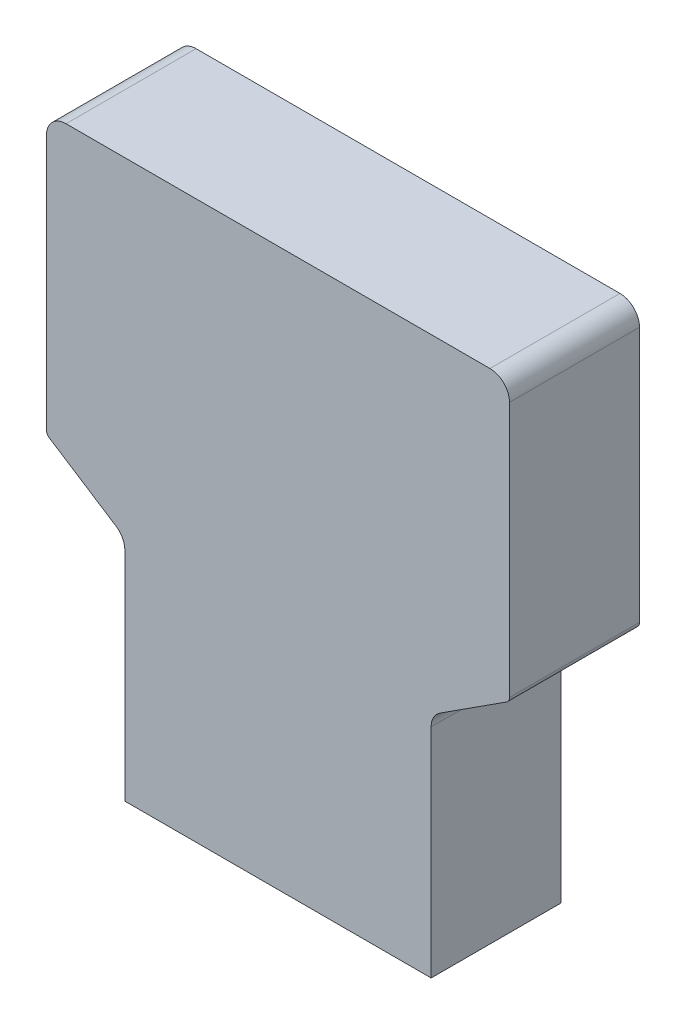
ISO-10303-21;
HEADER;
FILE_DESCRIPTION(('STEP AP214'),'2;1');
FILE_NAME('part.step','',(''),(''),'','','');
FILE_SCHEMA(('AUTOMOTIVE_DESIGN { 1 0 10303 214 1 1 1 1 }'));
ENDSEC;
DATA;
#1=APPLICATION_CONTEXT('core data for automotive mechanical design processes');
#2=APPLICATION_PROTOCOL_DEFINITION('international standard','automotive_design',2000,#1);
#3=PRODUCT_CONTEXT('',#1,'mechanical');
#4=PRODUCT('Part','Part','',(#3));
#5=PRODUCT_RELATED_PRODUCT_CATEGORY('part','',(#4));
#6=PRODUCT_DEFINITION_FORMATION('','',#4);
#7=PRODUCT_DEFINITION_CONTEXT('part definition',#1,'design');
#8=PRODUCT_DEFINITION('design','',#6,#7);
#9=PRODUCT_DEFINITION_SHAPE('','',#8);
#10=(LENGTH_UNIT() NAMED_UNIT(*) SI_UNIT(.MILLI.,.METRE.));
#11=(NAMED_UNIT(*) PLANE_ANGLE_UNIT() SI_UNIT($,.RADIAN.));
#12=(NAMED_UNIT(*) SI_UNIT($,.STERADIAN.) SOLID_ANGLE_UNIT());
#13=UNCERTAINTY_MEASURE_WITH_UNIT(LENGTH_MEASURE(1.E-05),#10,'distance_accuracy_value','');
#14=(GEOMETRIC_REPRESENTATION_CONTEXT(3) GLOBAL_UNCERTAINTY_ASSIGNED_CONTEXT((#13)) GLOBAL_UNIT_ASSIGNED_CONTEXT((#10,
#11,#12)) REPRESENTATION_CONTEXT('',''));
#15=CARTESIAN_POINT('',(0.,0.,0.));
#16=DIRECTION('',(0.,0.,1.));
#17=DIRECTION('',(1.,0.,0.));
#18=AXIS2_PLACEMENT_3D('',#15,#16,#17);
#19=CARTESIAN_POINT('',(20.2172812548055,0.,9.975));
#20=DIRECTION('',(-1.,0.,0.));
#21=DIRECTION('',(0.,-1.,0.));
#22=AXIS2_PLACEMENT_3D('',#19,#20,#21);
#23=PLANE('',#22);
#24=DIRECTION('',(0.,1.,0.));
#25=VECTOR('',#24,1.);
#26=CARTESIAN_POINT('',(20.2172812548055,0.,-9.975));
#27=LINE('',#26,#25);
#28=CARTESIAN_POINT('',(20.2172812548055,-38.7990927264339,-9.975));
#29=VERTEX_POINT('',#28);
#30=CARTESIAN_POINT('',(20.2172812548055,-5.43432971414005,-9.975));
#31=VERTEX_POINT('',#30);
#32=EDGE_CURVE('E166',#29,#31,#27,.T.);
#33=ORIENTED_EDGE('',*,*,#32,.T.);
#34=DIRECTION('',(0.,0.,-1.));
#35=VECTOR('',#34,1.);
#36=CARTESIAN_POINT('',(20.2172812548055,-5.43432971414005,9.975));
#37=LINE('',#36,#35);
#38=CARTESIAN_POINT('',(20.2172812548055,-5.43432971414005,9.975));
#39=VERTEX_POINT('',#38);
#40=EDGE_CURVE('E11',#39,#31,#37,.T.);
#41=ORIENTED_EDGE('',*,*,#40,.F.);
#42=DIRECTION('',(0.,1.,0.));
#43=VECTOR('',#42,1.);
#44=CARTESIAN_POINT('',(20.2172812548055,0.,9.975));
#45=LINE('',#44,#43);
#46=CARTESIAN_POINT('',(20.2172812548055,-38.7990927264339,9.975));
#47=VERTEX_POINT('',#46);
#48=EDGE_CURVE('E200',#47,#39,#45,.T.);
#49=ORIENTED_EDGE('',*,*,#48,.F.);
#50=DIRECTION('',(0.,0.,-1.));
#51=VECTOR('',#50,1.);
#52=CARTESIAN_POINT('',(20.2172812548055,-38.7990927264339,9.975));
#53=LINE('',#52,#51);
#54=EDGE_CURVE('E162',#47,#29,#53,.T.);
#55=ORIENTED_EDGE('',*,*,#54,.T.);
#56=EDGE_LOOP('',(#33,#41,#49,#55));
#57=FACE_BOUND('',#56,.T.);
#58=ADVANCED_FACE('F35',(#57),#23,.F.);
#59=CARTESIAN_POINT('',(23.2172812548055,-5.43432971414005,9.975));
#60=DIRECTION('',(0.,0.,-1.));
#61=DIRECTION('',(-1.,0.,0.));
#62=AXIS2_PLACEMENT_3D('',#59,#60,#61);
#63=CYLINDRICAL_SURFACE('',#62,3.);
#64=CARTESIAN_POINT('',(23.2172812548055,-5.43432971414005,-9.975));
#65=DIRECTION('',(0.,0.,1.));
#66=DIRECTION('',(1.,0.,0.));
#67=AXIS2_PLACEMENT_3D('',#64,#65,#66);
#68=CIRCLE('',#67,3.);
#69=CARTESIAN_POINT('',(21.5916173887424,-2.91297749864601,-9.975));
#70=VERTEX_POINT('',#69);
#71=EDGE_CURVE('E169',#31,#70,#68,.F.);
#72=ORIENTED_EDGE('',*,*,#71,.T.);
#73=DIRECTION('',(0.,0.,-1.));
#74=VECTOR('',#73,1.);
#75=CARTESIAN_POINT('',(21.5916173887424,-2.91297749864601,9.975));
#76=LINE('',#75,#74);
#77=CARTESIAN_POINT('',(21.5916173887424,-2.91297749864601,9.975));
#78=VERTEX_POINT('',#77);
#79=EDGE_CURVE('E43',#78,#70,#76,.T.);
#80=ORIENTED_EDGE('',*,*,#79,.F.);
#81=CARTESIAN_POINT('',(23.2172812548055,-5.43432971414005,9.975));
#82=DIRECTION('',(0.,0.,1.));
#83=DIRECTION('',(1.,0.,0.));
#84=AXIS2_PLACEMENT_3D('',#81,#82,#83);
#85=CIRCLE('',#84,3.);
#86=EDGE_CURVE('E108',#39,#78,#85,.F.);
#87=ORIENTED_EDGE('',*,*,#86,.F.);
#88=ORIENTED_EDGE('',*,*,#40,.T.);
#89=EDGE_LOOP('',(#72,#80,#87,#88));
#90=FACE_BOUND('',#89,.T.);
#91=ADVANCED_FACE('F280',(#90),#63,.F.);
#92=CARTESIAN_POINT('',(7.66687544909988,-11.8910765029911,9.975));
#93=DIRECTION('',(-0.541887955354373,0.840450738498014,0.));
#94=DIRECTION('',(-0.840450738498014,-0.541887955354373,0.));
#95=AXIS2_PLACEMENT_3D('',#92,#93,#94);
#96=PLANE('',#95);
#97=DIRECTION('',(0.840450738498014,0.541887955354373,0.));
#98=VECTOR('',#97,1.);
#99=CARTESIAN_POINT('',(7.66687544909988,-11.8910765029911,-9.975));
#100=LINE('',#99,#98);
#101=CARTESIAN_POINT('',(31.7791692101599,3.65553553097007,-9.975));
#102=VERTEX_POINT('',#101);
#103=EDGE_CURVE('E171',#70,#102,#100,.T.);
#104=ORIENTED_EDGE('',*,*,#103,.T.);
#105=DIRECTION('',(0.,0.,-1.));
#106=VECTOR('',#105,1.);
#107=CARTESIAN_POINT('',(31.7791692101599,3.65553553097007,9.975));
#108=LINE('',#107,#106);
#109=CARTESIAN_POINT('',(31.7791692101599,3.65553553097007,9.975));
#110=VERTEX_POINT('',#109);
#111=EDGE_CURVE('E219',#110,#102,#108,.T.);
#112=ORIENTED_EDGE('',*,*,#111,.F.);
#113=DIRECTION('',(0.840450738498014,0.541887955354373,0.));
#114=VECTOR('',#113,1.);
#115=CARTESIAN_POINT('',(7.66687544909988,-11.8910765029911,9.975));
#116=LINE('',#115,#114);
#117=EDGE_CURVE('E227',#78,#110,#116,.T.);
#118=ORIENTED_EDGE('',*,*,#117,.F.);
#119=ORIENTED_EDGE('',*,*,#79,.T.);
#120=EDGE_LOOP('',(#104,#112,#118,#119));
#121=FACE_BOUND('',#120,.T.);
#122=ADVANCED_FACE('F225',(#121),#96,.F.);
#123=CARTESIAN_POINT('',(31.2372812548055,4.49598626946809,9.975));
#124=DIRECTION('',(0.,0.,-1.));
#125=DIRECTION('',(-1.,0.,0.));
#126=AXIS2_PLACEMENT_3D('',#123,#124,#125);
#127=CYLINDRICAL_SURFACE('',#126,1.);
#128=CARTESIAN_POINT('',(31.2372812548055,4.49598626946809,-9.975));
#129=DIRECTION('',(0.,0.,1.));
#130=DIRECTION('',(1.,0.,0.));
#131=AXIS2_PLACEMENT_3D('',#128,#129,#130);
#132=CIRCLE('',#131,1.);
#133=CARTESIAN_POINT('',(32.2372812548055,4.49598626946809,-9.975));
#134=VERTEX_POINT('',#133);
#135=EDGE_CURVE('E173',#102,#134,#132,.T.);
#136=ORIENTED_EDGE('',*,*,#135,.T.);
#137=DIRECTION('',(0.,0.,-1.));
#138=VECTOR('',#137,1.);
#139=CARTESIAN_POINT('',(32.2372812548055,4.49598626946809,9.975));
#140=LINE('',#139,#138);
#141=CARTESIAN_POINT('',(32.2372812548055,4.49598626946809,9.975));
#142=VERTEX_POINT('',#141);
#143=EDGE_CURVE('E216',#142,#134,#140,.T.);
#144=ORIENTED_EDGE('',*,*,#143,.F.);
#145=CARTESIAN_POINT('',(31.2372812548055,4.49598626946809,9.975));
#146=DIRECTION('',(0.,0.,1.));
#147=DIRECTION('',(1.,0.,0.));
#148=AXIS2_PLACEMENT_3D('',#145,#146,#147);
#149=CIRCLE('',#148,1.);
#150=EDGE_CURVE('E245',#110,#142,#149,.T.);
#151=ORIENTED_EDGE('',*,*,#150,.F.);
#152=ORIENTED_EDGE('',*,*,#111,.T.);
#153=EDGE_LOOP('',(#136,#144,#151,#152));
#154=FACE_BOUND('',#153,.T.);
#155=ADVANCED_FACE('F235',(#154),#127,.T.);
#156=CARTESIAN_POINT('',(32.2372812548055,0.,9.975));
#157=DIRECTION('',(-1.,0.,0.));
#158=DIRECTION('',(0.,-1.,0.));
#159=AXIS2_PLACEMENT_3D('',#156,#157,#158);
#160=PLANE('',#159);
#161=DIRECTION('',(0.,1.,0.));
#162=VECTOR('',#161,1.);
#163=CARTESIAN_POINT('',(32.2372812548055,0.,-9.975));
#164=LINE('',#163,#162);
#165=CARTESIAN_POINT('',(32.2372812548055,43.7009072735661,-9.975));
#166=VERTEX_POINT('',#165);
#167=EDGE_CURVE('E175',#134,#166,#164,.T.);
#168=ORIENTED_EDGE('',*,*,#167,.T.);
#169=DIRECTION('',(0.,0.,-1.));
#170=VECTOR('',#169,1.);
#171=CARTESIAN_POINT('',(32.2372812548055,43.7009072735661,9.975));
#172=LINE('',#171,#170);
#173=CARTESIAN_POINT('',(32.2372812548055,43.7009072735661,9.975));
#174=VERTEX_POINT('',#173);
#175=EDGE_CURVE('E214',#174,#166,#172,.T.);
#176=ORIENTED_EDGE('',*,*,#175,.F.);
#177=DIRECTION('',(0.,1.,0.));
#178=VECTOR('',#177,1.);
#179=CARTESIAN_POINT('',(32.2372812548055,0.,9.975));
#180=LINE('',#179,#178);
#181=EDGE_CURVE('E241',#142,#174,#180,.T.);
#182=ORIENTED_EDGE('',*,*,#181,.F.);
#183=ORIENTED_EDGE('',*,*,#143,.T.);
#184=EDGE_LOOP('',(#168,#176,#182,#183));
#185=FACE_BOUND('',#184,.T.);
#186=ADVANCED_FACE('F239',(#185),#160,.F.);
#187=CARTESIAN_POINT('',(29.2372812548055,43.7009072735661,9.975));
#188=DIRECTION('',(0.,0.,-1.));
#189=DIRECTION('',(-1.,0.,0.));
#190=AXIS2_PLACEMENT_3D('',#187,#188,#189);
#191=CYLINDRICAL_SURFACE('',#190,3.);
#192=CARTESIAN_POINT('',(29.2372812548055,43.7009072735661,-9.975));
#193=DIRECTION('',(0.,0.,1.));
#194=DIRECTION('',(1.,0.,0.));
#195=AXIS2_PLACEMENT_3D('',#192,#193,#194);
#196=CIRCLE('',#195,3.);
#197=CARTESIAN_POINT('',(29.2372812548055,46.7009072735661,-9.975));
#198=VERTEX_POINT('',#197);
#199=EDGE_CURVE('E178',#198,#166,#196,.F.);
#200=ORIENTED_EDGE('',*,*,#199,.F.);
#201=DIRECTION('',(0.,0.,-1.));
#202=VECTOR('',#201,1.);
#203=CARTESIAN_POINT('',(29.2372812548055,46.7009072735661,9.975));
#204=LINE('',#203,#202);
#205=CARTESIAN_POINT('',(29.2372812548055,46.7009072735661,9.975));
#206=VERTEX_POINT('',#205);
#207=EDGE_CURVE('E212',#206,#198,#204,.T.);
#208=ORIENTED_EDGE('',*,*,#207,.F.);
#209=CARTESIAN_POINT('',(29.2372812548055,43.7009072735661,9.975));
#210=DIRECTION('',(0.,0.,1.));
#211=DIRECTION('',(1.,0.,0.));
#212=AXIS2_PLACEMENT_3D('',#209,#210,#211);
#213=CIRCLE('',#212,3.);
#214=EDGE_CURVE('E244',#206,#174,#213,.F.);
#215=ORIENTED_EDGE('',*,*,#214,.T.);
#216=ORIENTED_EDGE('',*,*,#175,.T.);
#217=EDGE_LOOP('',(#200,#208,#215,#216));
#218=FACE_BOUND('',#217,.T.);
#219=ADVANCED_FACE('F293',(#218),#191,.T.);
#220=CARTESIAN_POINT('',(0.,46.7009072735661,9.975));
#221=DIRECTION('',(0.,1.,0.));
#222=DIRECTION('',(-1.,0.,0.));
#223=AXIS2_PLACEMENT_3D('',#220,#221,#222);
#224=PLANE('',#223);
#225=DIRECTION('',(1.,0.,0.));
#226=VECTOR('',#225,1.);
#227=CARTESIAN_POINT('',(0.,46.7009072735661,-9.975));
#228=LINE('',#227,#226);
#229=CARTESIAN_POINT('',(-35.8027187451945,46.7009072735661,-9.975));
#230=VERTEX_POINT('',#229);
#231=EDGE_CURVE('E181',#230,#198,#228,.T.);
#232=ORIENTED_EDGE('',*,*,#231,.F.);
#233=DIRECTION('',(0.,0.,-1.));
#234=VECTOR('',#233,1.);
#235=CARTESIAN_POINT('',(-35.8027187451945,46.7009072735661,9.975));
#236=LINE('',#235,#234);
#237=CARTESIAN_POINT('',(-35.8027187451945,46.7009072735661,9.975));
#238=VERTEX_POINT('',#237);
#239=EDGE_CURVE('E210',#238,#230,#236,.T.);
#240=ORIENTED_EDGE('',*,*,#239,.F.);
#241=DIRECTION('',(1.,0.,0.));
#242=VECTOR('',#241,1.);
#243=CARTESIAN_POINT('',(0.,46.7009072735661,9.975));
#244=LINE('',#243,#242);
#245=EDGE_CURVE('E247',#238,#206,#244,.T.);
#246=ORIENTED_EDGE('',*,*,#245,.T.);
#247=ORIENTED_EDGE('',*,*,#207,.T.);
#248=EDGE_LOOP('',(#232,#240,#246,#247));
#249=FACE_BOUND('',#248,.T.);
#250=ADVANCED_FACE('F296',(#249),#224,.T.);
#251=CARTESIAN_POINT('',(-35.8027187451945,43.7009072735661,9.975));
#252=DIRECTION('',(0.,0.,-1.));
#253=DIRECTION('',(-1.,0.,0.));
#254=AXIS2_PLACEMENT_3D('',#251,#252,#253);
#255=CYLINDRICAL_SURFACE('',#254,3.00000000000001);
#256=CARTESIAN_POINT('',(-35.8027187451945,43.7009072735661,-9.975));
#257=DIRECTION('',(0.,0.,1.));
#258=DIRECTION('',(1.,0.,0.));
#259=AXIS2_PLACEMENT_3D('',#256,#257,#258);
#260=CIRCLE('',#259,3.00000000000001);
#261=CARTESIAN_POINT('',(-38.8027187451945,43.7009072735661,-9.975));
#262=VERTEX_POINT('',#261);
#263=EDGE_CURVE('E184',#262,#230,#260,.F.);
#264=ORIENTED_EDGE('',*,*,#263,.F.);
#265=DIRECTION('',(0.,0.,-1.));
#266=VECTOR('',#265,1.);
#267=CARTESIAN_POINT('',(-38.8027187451945,43.7009072735661,9.975));
#268=LINE('',#267,#266);
#269=CARTESIAN_POINT('',(-38.8027187451945,43.7009072735661,9.975));
#270=VERTEX_POINT('',#269);
#271=EDGE_CURVE('E208',#270,#262,#268,.T.);
#272=ORIENTED_EDGE('',*,*,#271,.F.);
#273=CARTESIAN_POINT('',(-35.8027187451945,43.7009072735661,9.975));
#274=DIRECTION('',(0.,0.,1.));
#275=DIRECTION('',(1.,0.,0.));
#276=AXIS2_PLACEMENT_3D('',#273,#274,#275);
#277=CIRCLE('',#276,3.00000000000001);
#278=EDGE_CURVE('E254',#270,#238,#277,.F.);
#279=ORIENTED_EDGE('',*,*,#278,.T.);
#280=ORIENTED_EDGE('',*,*,#239,.T.);
#281=EDGE_LOOP('',(#264,#272,#279,#280));
#282=FACE_BOUND('',#281,.T.);
#283=ADVANCED_FACE('F300',(#282),#255,.T.);
#284=CARTESIAN_POINT('',(-38.8027187451945,0.,9.975));
#285=DIRECTION('',(-1.,0.,0.));
#286=DIRECTION('',(0.,-1.,0.));
#287=AXIS2_PLACEMENT_3D('',#284,#285,#286);
#288=PLANE('',#287);
#289=DIRECTION('',(0.,1.,0.));
#290=VECTOR('',#289,1.);
#291=CARTESIAN_POINT('',(-38.8027187451945,0.,-9.975));
#292=LINE('',#291,#290);
#293=CARTESIAN_POINT('',(-38.8027187451945,4.49598626946811,-9.975));
#294=VERTEX_POINT('',#293);
#295=EDGE_CURVE('E187',#294,#262,#292,.T.);
#296=ORIENTED_EDGE('',*,*,#295,.F.);
#297=DIRECTION('',(0.,0.,-1.));
#298=VECTOR('',#297,1.);
#299=CARTESIAN_POINT('',(-38.8027187451945,4.49598626946811,9.975));
#300=LINE('',#299,#298);
#301=CARTESIAN_POINT('',(-38.8027187451945,4.49598626946811,9.975));
#302=VERTEX_POINT('',#301);
#303=EDGE_CURVE('E206',#302,#294,#300,.T.);
#304=ORIENTED_EDGE('',*,*,#303,.F.);
#305=DIRECTION('',(0.,1.,0.));
#306=VECTOR('',#305,1.);
#307=CARTESIAN_POINT('',(-38.8027187451945,0.,9.975));
#308=LINE('',#307,#306);
#309=EDGE_CURVE('E257',#302,#270,#308,.T.);
#310=ORIENTED_EDGE('',*,*,#309,.T.);
#311=ORIENTED_EDGE('',*,*,#271,.T.);
#312=EDGE_LOOP('',(#296,#304,#310,#311));
#313=FACE_BOUND('',#312,.T.);
#314=ADVANCED_FACE('F304',(#313),#288,.T.);
#315=CARTESIAN_POINT('',(-37.8027187451945,4.49598626946811,9.975));
#316=DIRECTION('',(0.,0.,-1.));
#317=DIRECTION('',(-1.,0.,0.));
#318=AXIS2_PLACEMENT_3D('',#315,#316,#317);
#319=CYLINDRICAL_SURFACE('',#318,1.);
#320=CARTESIAN_POINT('',(-37.8027187451945,4.49598626946811,-9.975));
#321=DIRECTION('',(0.,0.,1.));
#322=DIRECTION('',(1.,0.,0.));
#323=AXIS2_PLACEMENT_3D('',#320,#321,#322);
#324=CIRCLE('',#323,1.);
#325=CARTESIAN_POINT('',(-38.3446067005489,3.6555355309701,-9.975));
#326=VERTEX_POINT('',#325);
#327=EDGE_CURVE('E190',#326,#294,#324,.F.);
#328=ORIENTED_EDGE('',*,*,#327,.F.);
#329=DIRECTION('',(0.,0.,-1.));
#330=VECTOR('',#329,1.);
#331=CARTESIAN_POINT('',(-38.3446067005489,3.6555355309701,9.975));
#332=LINE('',#331,#330);
#333=CARTESIAN_POINT('',(-38.3446067005489,3.6555355309701,9.975));
#334=VERTEX_POINT('',#333);
#335=EDGE_CURVE('E204',#334,#326,#332,.T.);
#336=ORIENTED_EDGE('',*,*,#335,.F.);
#337=CARTESIAN_POINT('',(-37.8027187451945,4.49598626946811,9.975));
#338=DIRECTION('',(0.,0.,1.));
#339=DIRECTION('',(1.,0.,0.));
#340=AXIS2_PLACEMENT_3D('',#337,#338,#339);
#341=CIRCLE('',#340,1.);
#342=EDGE_CURVE('E260',#334,#302,#341,.F.);
#343=ORIENTED_EDGE('',*,*,#342,.T.);
#344=ORIENTED_EDGE('',*,*,#303,.T.);
#345=EDGE_LOOP('',(#328,#336,#343,#344));
#346=FACE_BOUND('',#345,.T.);
#347=ADVANCED_FACE('F308',(#346),#319,.T.);
#348=CARTESIAN_POINT('',(-9.5947672960743,-14.8811745675888,9.975));
#349=DIRECTION('',(-0.541887955354375,-0.840450738498013,0.));
#350=DIRECTION('',(0.840450738498013,-0.541887955354375,0.));
#351=AXIS2_PLACEMENT_3D('',#348,#349,#350);
#352=PLANE('',#351);
#353=DIRECTION('',(-0.840450738498013,0.541887955354375,0.));
#354=VECTOR('',#353,1.);
#355=CARTESIAN_POINT('',(-9.5947672960743,-14.8811745675888,-9.975));
#356=LINE('',#355,#354);
#357=CARTESIAN_POINT('',(-28.1570548791314,-2.91297749864601,-9.975));
#358=VERTEX_POINT('',#357);
#359=EDGE_CURVE('E193',#358,#326,#356,.T.);
#360=ORIENTED_EDGE('',*,*,#359,.F.);
#361=DIRECTION('',(0.,0.,-1.));
#362=VECTOR('',#361,1.);
#363=CARTESIAN_POINT('',(-28.1570548791314,-2.91297749864601,9.975));
#364=LINE('',#363,#362);
#365=CARTESIAN_POINT('',(-28.1570548791314,-2.91297749864601,9.975));
#366=VERTEX_POINT('',#365);
#367=EDGE_CURVE('E151',#366,#358,#364,.T.);
#368=ORIENTED_EDGE('',*,*,#367,.F.);
#369=DIRECTION('',(-0.840450738498013,0.541887955354375,0.));
#370=VECTOR('',#369,1.);
#371=CARTESIAN_POINT('',(-9.5947672960743,-14.8811745675888,9.975));
#372=LINE('',#371,#370);
#373=EDGE_CURVE('E158',#366,#334,#372,.T.);
#374=ORIENTED_EDGE('',*,*,#373,.T.);
#375=ORIENTED_EDGE('',*,*,#335,.T.);
#376=EDGE_LOOP('',(#360,#368,#374,#375));
#377=FACE_BOUND('',#376,.T.);
#378=ADVANCED_FACE('F264',(#377),#352,.T.);
#379=CARTESIAN_POINT('',(-29.7827187451945,-5.43432971414004,9.975));
#380=DIRECTION('',(0.,0.,-1.));
#381=DIRECTION('',(-1.,0.,0.));
#382=AXIS2_PLACEMENT_3D('',#379,#380,#381);
#383=CYLINDRICAL_SURFACE('',#382,3.);
#384=CARTESIAN_POINT('',(-29.7827187451945,-5.43432971414004,-9.975));
#385=DIRECTION('',(0.,0.,1.));
#386=DIRECTION('',(1.,0.,0.));
#387=AXIS2_PLACEMENT_3D('',#384,#385,#386);
#388=CIRCLE('',#387,3.);
#389=CARTESIAN_POINT('',(-26.7827187451945,-5.43432971414004,-9.975));
#390=VERTEX_POINT('',#389);
#391=EDGE_CURVE('E146',#390,#358,#388,.T.);
#392=ORIENTED_EDGE('',*,*,#391,.F.);
#393=DIRECTION('',(0.,0.,-1.));
#394=VECTOR('',#393,1.);
#395=CARTESIAN_POINT('',(-26.7827187451945,-5.43432971414004,9.975));
#396=LINE('',#395,#394);
#397=CARTESIAN_POINT('',(-26.7827187451945,-5.43432971414004,9.975));
#398=VERTEX_POINT('',#397);
#399=EDGE_CURVE('E141',#398,#390,#396,.T.);
#400=ORIENTED_EDGE('',*,*,#399,.F.);
#401=CARTESIAN_POINT('',(-29.7827187451945,-5.43432971414004,9.975));
#402=DIRECTION('',(0.,0.,1.));
#403=DIRECTION('',(1.,0.,0.));
#404=AXIS2_PLACEMENT_3D('',#401,#402,#403);
#405=CIRCLE('',#404,3.);
#406=EDGE_CURVE('E144',#398,#366,#405,.T.);
#407=ORIENTED_EDGE('',*,*,#406,.T.);
#408=ORIENTED_EDGE('',*,*,#367,.T.);
#409=EDGE_LOOP('',(#392,#400,#407,#408));
#410=FACE_BOUND('',#409,.T.);
#411=ADVANCED_FACE('F143',(#410),#383,.F.);
#412=CARTESIAN_POINT('',(-26.7827187451945,0.,9.975));
#413=DIRECTION('',(-1.,0.,0.));
#414=DIRECTION('',(0.,0.,1.));
#415=AXIS2_PLACEMENT_3D('',#412,#413,#414);
#416=PLANE('',#415);
#417=DIRECTION('',(0.,1.,0.));
#418=VECTOR('',#417,1.);
#419=CARTESIAN_POINT('',(-26.7827187451945,0.,-9.975));
#420=LINE('',#419,#418);
#421=CARTESIAN_POINT('',(-26.7827187451945,-38.7990927264339,-9.975));
#422=VERTEX_POINT('',#421);
#423=EDGE_CURVE('E197',#422,#390,#420,.T.);
#424=ORIENTED_EDGE('',*,*,#423,.F.);
#425=DIRECTION('',(0.,0.,-1.));
#426=VECTOR('',#425,1.);
#427=CARTESIAN_POINT('',(-26.7827187451945,-38.7990927264339,9.975));
#428=LINE('',#427,#426);
#429=CARTESIAN_POINT('',(-26.7827187451945,-38.7990927264339,9.975));
#430=VERTEX_POINT('',#429);
#431=EDGE_CURVE('E97',#430,#422,#428,.T.);
#432=ORIENTED_EDGE('',*,*,#431,.F.);
#433=DIRECTION('',(0.,1.,0.));
#434=VECTOR('',#433,1.);
#435=CARTESIAN_POINT('',(-26.7827187451945,0.,9.975));
#436=LINE('',#435,#434);
#437=EDGE_CURVE('E155',#430,#398,#436,.T.);
#438=ORIENTED_EDGE('',*,*,#437,.T.);
#439=ORIENTED_EDGE('',*,*,#399,.T.);
#440=EDGE_LOOP('',(#424,#432,#438,#439));
#441=FACE_BOUND('',#440,.T.);
#442=ADVANCED_FACE('F160',(#441),#416,.T.);
#443=CARTESIAN_POINT('',(0.,-38.7990927264339,9.975));
#444=DIRECTION('',(0.,1.,0.));
#445=DIRECTION('',(0.,0.,1.));
#446=AXIS2_PLACEMENT_3D('',#443,#444,#445);
#447=PLANE('',#446);
#448=DIRECTION('',(1.,0.,0.));
#449=VECTOR('',#448,1.);
#450=CARTESIAN_POINT('',(0.,-38.7990927264339,-9.975));
#451=LINE('',#450,#449);
#452=EDGE_CURVE('E100',#422,#29,#451,.T.);
#453=ORIENTED_EDGE('',*,*,#452,.T.);
#454=ORIENTED_EDGE('',*,*,#54,.F.);
#455=DIRECTION('',(1.,0.,0.));
#456=VECTOR('',#455,1.);
#457=CARTESIAN_POINT('',(0.,-38.7990927264339,9.975));
#458=LINE('',#457,#456);
#459=EDGE_CURVE('E51',#430,#47,#458,.T.);
#460=ORIENTED_EDGE('',*,*,#459,.F.);
#461=ORIENTED_EDGE('',*,*,#431,.T.);
#462=EDGE_LOOP('',(#453,#454,#460,#461));
#463=FACE_BOUND('',#462,.T.);
#464=ADVANCED_FACE('F269',(#463),#447,.F.);
#465=CARTESIAN_POINT('',(0.,0.,9.975));
#466=DIRECTION('',(0.,0.,1.));
#467=DIRECTION('',(1.,0.,0.));
#468=AXIS2_PLACEMENT_3D('',#465,#466,#467);
#469=PLANE('',#468);
#470=ORIENTED_EDGE('',*,*,#48,.T.);
#471=ORIENTED_EDGE('',*,*,#86,.T.);
#472=ORIENTED_EDGE('',*,*,#117,.T.);
#473=ORIENTED_EDGE('',*,*,#150,.T.);
#474=ORIENTED_EDGE('',*,*,#181,.T.);
#475=ORIENTED_EDGE('',*,*,#214,.F.);
#476=ORIENTED_EDGE('',*,*,#245,.F.);
#477=ORIENTED_EDGE('',*,*,#278,.F.);
#478=ORIENTED_EDGE('',*,*,#309,.F.);
#479=ORIENTED_EDGE('',*,*,#342,.F.);
#480=ORIENTED_EDGE('',*,*,#373,.F.);
#481=ORIENTED_EDGE('',*,*,#406,.F.);
#482=ORIENTED_EDGE('',*,*,#437,.F.);
#483=ORIENTED_EDGE('',*,*,#459,.T.);
#484=EDGE_LOOP('',(#470,#471,#472,#473,#474,#475,#476,#477,#478,#479,#480,#481,#482,#483));
#485=FACE_BOUND('',#484,.T.);
#486=ADVANCED_FACE('F154',(#485),#469,.T.);
#487=CARTESIAN_POINT('',(0.,0.,-9.975));
#488=DIRECTION('',(0.,0.,1.));
#489=DIRECTION('',(1.,0.,0.));
#490=AXIS2_PLACEMENT_3D('',#487,#488,#489);
#491=PLANE('',#490);
#492=ORIENTED_EDGE('',*,*,#32,.F.);
#493=ORIENTED_EDGE('',*,*,#452,.F.);
#494=ORIENTED_EDGE('',*,*,#423,.T.);
#495=ORIENTED_EDGE('',*,*,#391,.T.);
#496=ORIENTED_EDGE('',*,*,#359,.T.);
#497=ORIENTED_EDGE('',*,*,#327,.T.);
#498=ORIENTED_EDGE('',*,*,#295,.T.);
#499=ORIENTED_EDGE('',*,*,#263,.T.);
#500=ORIENTED_EDGE('',*,*,#231,.T.);
#501=ORIENTED_EDGE('',*,*,#199,.T.);
#502=ORIENTED_EDGE('',*,*,#167,.F.);
#503=ORIENTED_EDGE('',*,*,#135,.F.);
#504=ORIENTED_EDGE('',*,*,#103,.F.);
#505=ORIENTED_EDGE('',*,*,#71,.F.);
#506=EDGE_LOOP('',(#492,#493,#494,#495,#496,#497,#498,#499,#500,#501,#502,#503,#504,#505));
#507=FACE_BOUND('',#506,.T.);
#508=ADVANCED_FACE('F231',(#507),#491,.F.);
#509=CLOSED_SHELL('',(#58,#91,#122,#155,#186,#219,#250,#283,#314,#347,#378,#411,#442,#464,#486,#508));
#510=MANIFOLD_SOLID_BREP('B2',#509);
#511=ADVANCED_BREP_SHAPE_REPRESENTATION('',(#18,#510),#14);
#512=SHAPE_DEFINITION_REPRESENTATION(#9,#511);
ENDSEC;
END-ISO-10303-21;
